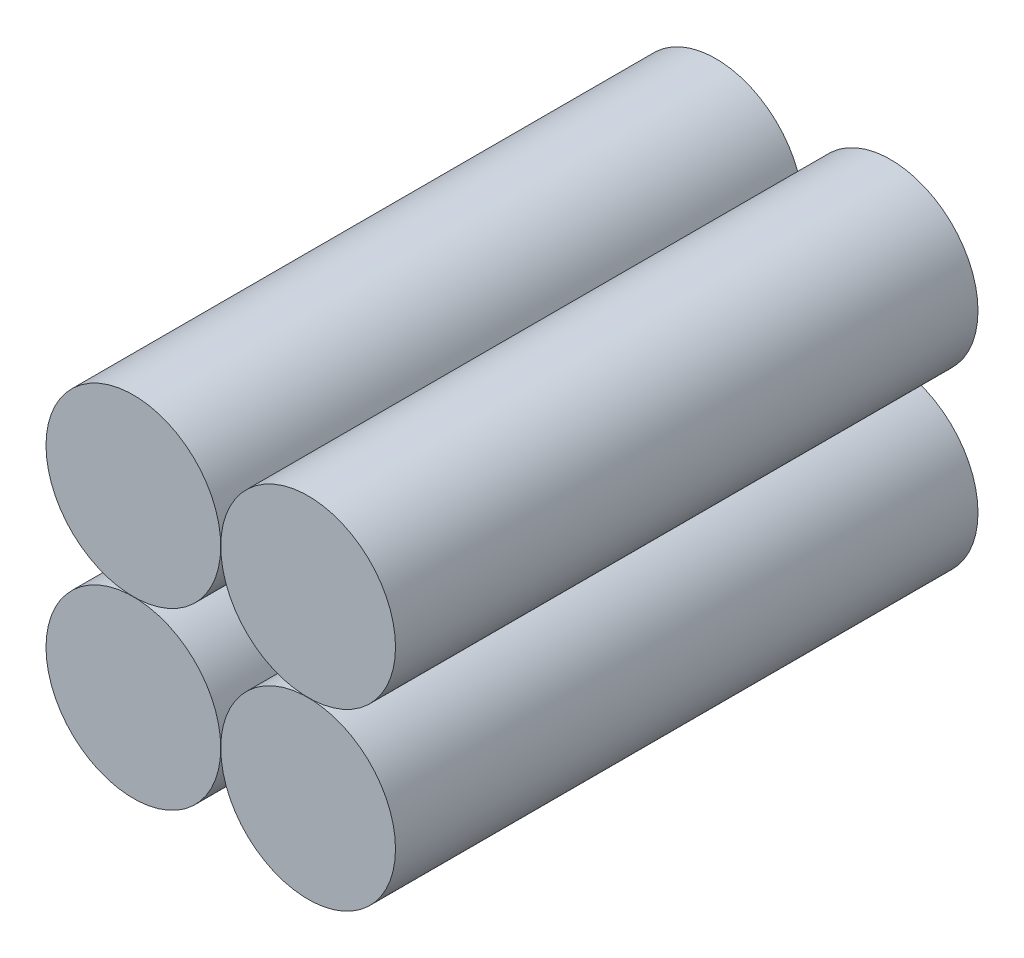
ISO-10303-21;
HEADER;
FILE_DESCRIPTION(('STEP AP214'),'2;1');
FILE_NAME('part.step','',(''),(''),'','','');
FILE_SCHEMA(('AUTOMOTIVE_DESIGN { 1 0 10303 214 1 1 1 1 }'));
ENDSEC;
DATA;
#1=APPLICATION_CONTEXT('core data for automotive mechanical design processes');
#2=APPLICATION_PROTOCOL_DEFINITION('international standard','automotive_design',2000,#1);
#3=PRODUCT_CONTEXT('',#1,'mechanical');
#4=PRODUCT('Part','Part','',(#3));
#5=PRODUCT_RELATED_PRODUCT_CATEGORY('part','',(#4));
#6=PRODUCT_DEFINITION_FORMATION('','',#4);
#7=PRODUCT_DEFINITION_CONTEXT('part definition',#1,'design');
#8=PRODUCT_DEFINITION('design','',#6,#7);
#9=PRODUCT_DEFINITION_SHAPE('','',#8);
#10=(LENGTH_UNIT() NAMED_UNIT(*) SI_UNIT(.MILLI.,.METRE.));
#11=(NAMED_UNIT(*) PLANE_ANGLE_UNIT() SI_UNIT($,.RADIAN.));
#12=(NAMED_UNIT(*) SI_UNIT($,.STERADIAN.) SOLID_ANGLE_UNIT());
#13=UNCERTAINTY_MEASURE_WITH_UNIT(LENGTH_MEASURE(1.E-05),#10,'distance_accuracy_value','');
#14=(GEOMETRIC_REPRESENTATION_CONTEXT(3) GLOBAL_UNCERTAINTY_ASSIGNED_CONTEXT((#13)) GLOBAL_UNIT_ASSIGNED_CONTEXT((#10,
#11,#12)) REPRESENTATION_CONTEXT('',''));
#15=CARTESIAN_POINT('',(0.,0.,0.));
#16=DIRECTION('',(0.,0.,1.));
#17=DIRECTION('',(1.,0.,0.));
#18=AXIS2_PLACEMENT_3D('',#15,#16,#17);
#19=CARTESIAN_POINT('',(10.5,-10.5,70.));
#20=DIRECTION('',(0.,0.,-1.));
#21=DIRECTION('',(-1.,0.,0.));
#22=AXIS2_PLACEMENT_3D('',#19,#20,#21);
#23=CYLINDRICAL_SURFACE('',#22,10.5);
#24=CARTESIAN_POINT('',(10.5,-10.5,70.));
#25=DIRECTION('',(0.,0.,1.));
#26=DIRECTION('',(1.,0.,0.));
#27=AXIS2_PLACEMENT_3D('',#24,#25,#26);
#28=CIRCLE('',#27,10.5);
#29=CARTESIAN_POINT('',(21.,-10.5,70.));
#30=VERTEX_POINT('',#29);
#31=EDGE_CURVE('E12',#30,#30,#28,.T.);
#32=ORIENTED_EDGE('',*,*,#31,.F.);
#33=EDGE_LOOP('',(#32));
#34=FACE_BOUND('',#33,.T.);
#35=CARTESIAN_POINT('',(10.5,-10.5,0.));
#36=DIRECTION('',(0.,0.,1.));
#37=DIRECTION('',(1.,0.,0.));
#38=AXIS2_PLACEMENT_3D('',#35,#36,#37);
#39=CIRCLE('',#38,10.5);
#40=CARTESIAN_POINT('',(21.,-10.5,0.));
#41=VERTEX_POINT('',#40);
#42=EDGE_CURVE('E64',#41,#41,#39,.T.);
#43=ORIENTED_EDGE('',*,*,#42,.T.);
#44=EDGE_LOOP('',(#43));
#45=FACE_BOUND('',#44,.T.);
#46=ADVANCED_FACE('F61',(#34,#45),#23,.T.);
#47=CARTESIAN_POINT('',(0.,0.,70.));
#48=DIRECTION('',(0.,0.,1.));
#49=DIRECTION('',(1.,0.,0.));
#50=AXIS2_PLACEMENT_3D('',#47,#48,#49);
#51=PLANE('',#50);
#52=ORIENTED_EDGE('',*,*,#31,.T.);
#53=EDGE_LOOP('',(#52));
#54=FACE_BOUND('',#53,.T.);
#55=ADVANCED_FACE('F76',(#54),#51,.T.);
#56=CARTESIAN_POINT('',(0.,0.,0.));
#57=DIRECTION('',(0.,0.,1.));
#58=DIRECTION('',(1.,0.,0.));
#59=AXIS2_PLACEMENT_3D('',#56,#57,#58);
#60=PLANE('',#59);
#61=ORIENTED_EDGE('',*,*,#42,.F.);
#62=EDGE_LOOP('',(#61));
#63=FACE_BOUND('',#62,.T.);
#64=ADVANCED_FACE('F74',(#63),#60,.F.);
#65=CLOSED_SHELL('',(#46,#55,#64));
#66=MANIFOLD_SOLID_BREP('B2',#65);
#67=CARTESIAN_POINT('',(-10.5,-10.5,70.));
#68=DIRECTION('',(0.,0.,-1.));
#69=DIRECTION('',(-1.,0.,0.));
#70=AXIS2_PLACEMENT_3D('',#67,#68,#69);
#71=CYLINDRICAL_SURFACE('',#70,10.5);
#72=CARTESIAN_POINT('',(-10.5,-10.5,70.));
#73=DIRECTION('',(0.,0.,1.));
#74=DIRECTION('',(1.,0.,0.));
#75=AXIS2_PLACEMENT_3D('',#72,#73,#74);
#76=CIRCLE('',#75,10.5);
#77=CARTESIAN_POINT('',(0.,-10.5,70.));
#78=VERTEX_POINT('',#77);
#79=EDGE_CURVE('E60',#78,#78,#76,.T.);
#80=ORIENTED_EDGE('',*,*,#79,.F.);
#81=EDGE_LOOP('',(#80));
#82=FACE_BOUND('',#81,.T.);
#83=CARTESIAN_POINT('',(-10.5,-10.5,0.));
#84=DIRECTION('',(0.,0.,1.));
#85=DIRECTION('',(1.,0.,0.));
#86=AXIS2_PLACEMENT_3D('',#83,#84,#85);
#87=CIRCLE('',#86,10.5);
#88=CARTESIAN_POINT('',(0.,-10.5,0.));
#89=VERTEX_POINT('',#88);
#90=EDGE_CURVE('E118',#89,#89,#87,.T.);
#91=ORIENTED_EDGE('',*,*,#90,.T.);
#92=EDGE_LOOP('',(#91));
#93=FACE_BOUND('',#92,.T.);
#94=ADVANCED_FACE('F115',(#82,#93),#71,.T.);
#95=CARTESIAN_POINT('',(0.,0.,70.));
#96=DIRECTION('',(0.,0.,1.));
#97=DIRECTION('',(1.,0.,0.));
#98=AXIS2_PLACEMENT_3D('',#95,#96,#97);
#99=PLANE('',#98);
#100=ORIENTED_EDGE('',*,*,#79,.T.);
#101=EDGE_LOOP('',(#100));
#102=FACE_BOUND('',#101,.T.);
#103=ADVANCED_FACE('F130',(#102),#99,.T.);
#104=CARTESIAN_POINT('',(0.,0.,0.));
#105=DIRECTION('',(0.,0.,1.));
#106=DIRECTION('',(1.,0.,0.));
#107=AXIS2_PLACEMENT_3D('',#104,#105,#106);
#108=PLANE('',#107);
#109=ORIENTED_EDGE('',*,*,#90,.F.);
#110=EDGE_LOOP('',(#109));
#111=FACE_BOUND('',#110,.T.);
#112=ADVANCED_FACE('F128',(#111),#108,.F.);
#113=CLOSED_SHELL('',(#94,#103,#112));
#114=MANIFOLD_SOLID_BREP('B7',#113);
#115=CARTESIAN_POINT('',(10.5,10.5,70.));
#116=DIRECTION('',(0.,0.,-1.));
#117=DIRECTION('',(-1.,0.,0.));
#118=AXIS2_PLACEMENT_3D('',#115,#116,#117);
#119=CYLINDRICAL_SURFACE('',#118,10.5);
#120=CARTESIAN_POINT('',(10.5,10.5,70.));
#121=DIRECTION('',(0.,0.,1.));
#122=DIRECTION('',(1.,0.,0.));
#123=AXIS2_PLACEMENT_3D('',#120,#121,#122);
#124=CIRCLE('',#123,10.5);
#125=CARTESIAN_POINT('',(21.,10.5,70.));
#126=VERTEX_POINT('',#125);
#127=EDGE_CURVE('E114',#126,#126,#124,.T.);
#128=ORIENTED_EDGE('',*,*,#127,.F.);
#129=EDGE_LOOP('',(#128));
#130=FACE_BOUND('',#129,.T.);
#131=CARTESIAN_POINT('',(10.5,10.5,0.));
#132=DIRECTION('',(0.,0.,1.));
#133=DIRECTION('',(1.,0.,0.));
#134=AXIS2_PLACEMENT_3D('',#131,#132,#133);
#135=CIRCLE('',#134,10.5);
#136=CARTESIAN_POINT('',(21.,10.5,0.));
#137=VERTEX_POINT('',#136);
#138=EDGE_CURVE('E171',#137,#137,#135,.T.);
#139=ORIENTED_EDGE('',*,*,#138,.T.);
#140=EDGE_LOOP('',(#139));
#141=FACE_BOUND('',#140,.T.);
#142=ADVANCED_FACE('F168',(#130,#141),#119,.T.);
#143=CARTESIAN_POINT('',(0.,0.,70.));
#144=DIRECTION('',(0.,0.,1.));
#145=DIRECTION('',(1.,0.,0.));
#146=AXIS2_PLACEMENT_3D('',#143,#144,#145);
#147=PLANE('',#146);
#148=ORIENTED_EDGE('',*,*,#127,.T.);
#149=EDGE_LOOP('',(#148));
#150=FACE_BOUND('',#149,.T.);
#151=ADVANCED_FACE('F183',(#150),#147,.T.);
#152=CARTESIAN_POINT('',(0.,0.,0.));
#153=DIRECTION('',(0.,0.,1.));
#154=DIRECTION('',(1.,0.,0.));
#155=AXIS2_PLACEMENT_3D('',#152,#153,#154);
#156=PLANE('',#155);
#157=ORIENTED_EDGE('',*,*,#138,.F.);
#158=EDGE_LOOP('',(#157));
#159=FACE_BOUND('',#158,.T.);
#160=ADVANCED_FACE('F181',(#159),#156,.F.);
#161=CLOSED_SHELL('',(#142,#151,#160));
#162=MANIFOLD_SOLID_BREP('B55',#161);
#163=CARTESIAN_POINT('',(-10.5,10.5,70.));
#164=DIRECTION('',(0.,0.,-1.));
#165=DIRECTION('',(-1.,0.,0.));
#166=AXIS2_PLACEMENT_3D('',#163,#164,#165);
#167=CYLINDRICAL_SURFACE('',#166,10.5);
#168=CARTESIAN_POINT('',(-10.5,10.5,70.));
#169=DIRECTION('',(0.,0.,1.));
#170=DIRECTION('',(1.,0.,0.));
#171=AXIS2_PLACEMENT_3D('',#168,#169,#170);
#172=CIRCLE('',#171,10.5);
#173=CARTESIAN_POINT('',(0.,10.5,70.));
#174=VERTEX_POINT('',#173);
#175=EDGE_CURVE('E167',#174,#174,#172,.T.);
#176=ORIENTED_EDGE('',*,*,#175,.F.);
#177=EDGE_LOOP('',(#176));
#178=FACE_BOUND('',#177,.T.);
#179=CARTESIAN_POINT('',(-10.5,10.5,0.));
#180=DIRECTION('',(0.,0.,1.));
#181=DIRECTION('',(1.,0.,0.));
#182=AXIS2_PLACEMENT_3D('',#179,#180,#181);
#183=CIRCLE('',#182,10.5);
#184=CARTESIAN_POINT('',(0.,10.5,0.));
#185=VERTEX_POINT('',#184);
#186=EDGE_CURVE('E217',#185,#185,#183,.T.);
#187=ORIENTED_EDGE('',*,*,#186,.T.);
#188=EDGE_LOOP('',(#187));
#189=FACE_BOUND('',#188,.T.);
#190=ADVANCED_FACE('F214',(#178,#189),#167,.T.);
#191=CARTESIAN_POINT('',(0.,0.,70.));
#192=DIRECTION('',(0.,0.,1.));
#193=DIRECTION('',(1.,0.,0.));
#194=AXIS2_PLACEMENT_3D('',#191,#192,#193);
#195=PLANE('',#194);
#196=ORIENTED_EDGE('',*,*,#175,.T.);
#197=EDGE_LOOP('',(#196));
#198=FACE_BOUND('',#197,.T.);
#199=ADVANCED_FACE('F229',(#198),#195,.T.);
#200=CARTESIAN_POINT('',(0.,0.,0.));
#201=DIRECTION('',(0.,0.,1.));
#202=DIRECTION('',(1.,0.,0.));
#203=AXIS2_PLACEMENT_3D('',#200,#201,#202);
#204=PLANE('',#203);
#205=ORIENTED_EDGE('',*,*,#186,.F.);
#206=EDGE_LOOP('',(#205));
#207=FACE_BOUND('',#206,.T.);
#208=ADVANCED_FACE('F227',(#207),#204,.F.);
#209=CLOSED_SHELL('',(#190,#199,#208));
#210=MANIFOLD_SOLID_BREP('B109',#209);
#211=ADVANCED_BREP_SHAPE_REPRESENTATION('',(#18,#66,#114,#162,#210),#14);
#212=SHAPE_DEFINITION_REPRESENTATION(#9,#211);
ENDSEC;
END-ISO-10303-21;
